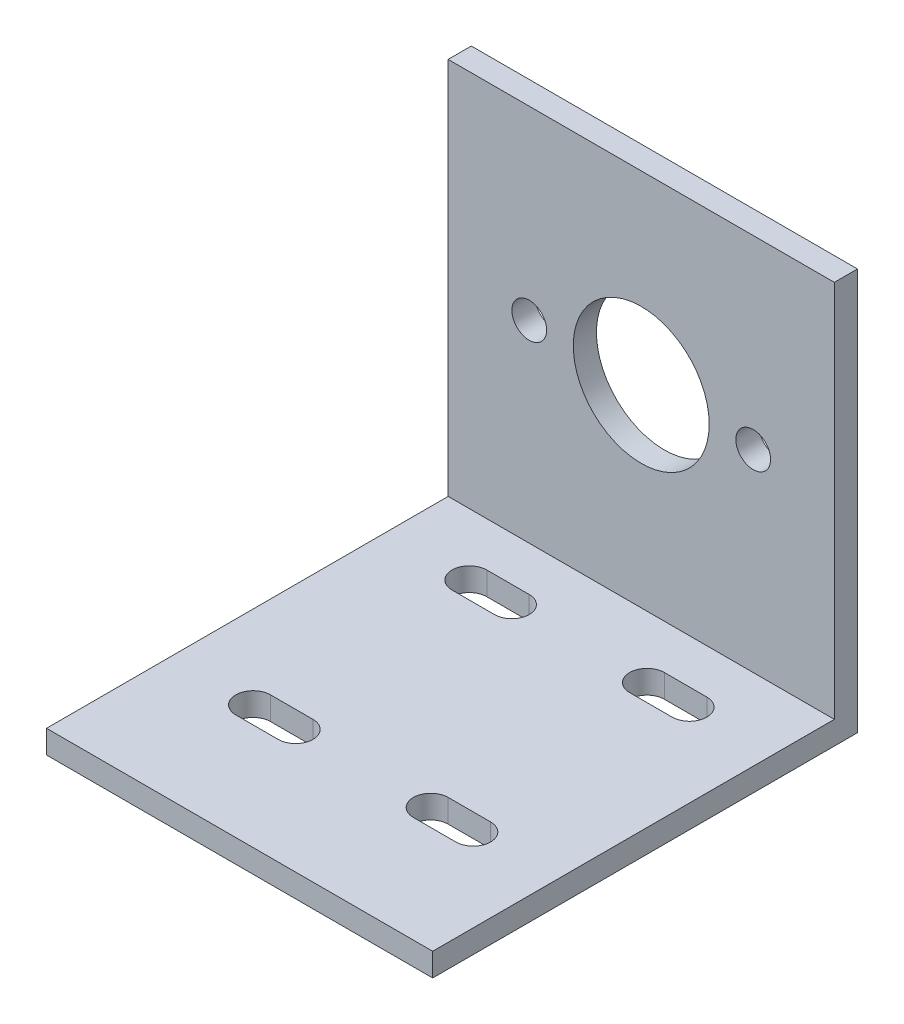
ISO-10303-21;
HEADER;
FILE_DESCRIPTION(('STEP AP214'),'2;1');
FILE_NAME('part.step','',(''),(''),'','','');
FILE_SCHEMA(('AUTOMOTIVE_DESIGN { 1 0 10303 214 1 1 1 1 }'));
ENDSEC;
DATA;
#1=APPLICATION_CONTEXT('core data for automotive mechanical design processes');
#2=APPLICATION_PROTOCOL_DEFINITION('international standard','automotive_design',2000,#1);
#3=PRODUCT_CONTEXT('',#1,'mechanical');
#4=PRODUCT('Part','Part','',(#3));
#5=PRODUCT_RELATED_PRODUCT_CATEGORY('part','',(#4));
#6=PRODUCT_DEFINITION_FORMATION('','',#4);
#7=PRODUCT_DEFINITION_CONTEXT('part definition',#1,'design');
#8=PRODUCT_DEFINITION('design','',#6,#7);
#9=PRODUCT_DEFINITION_SHAPE('','',#8);
#10=(LENGTH_UNIT() NAMED_UNIT(*) SI_UNIT(.MILLI.,.METRE.));
#11=(NAMED_UNIT(*) PLANE_ANGLE_UNIT() SI_UNIT($,.RADIAN.));
#12=(NAMED_UNIT(*) SI_UNIT($,.STERADIAN.) SOLID_ANGLE_UNIT());
#13=UNCERTAINTY_MEASURE_WITH_UNIT(LENGTH_MEASURE(1.E-05),#10,'distance_accuracy_value','');
#14=(GEOMETRIC_REPRESENTATION_CONTEXT(3) GLOBAL_UNCERTAINTY_ASSIGNED_CONTEXT((#13)) GLOBAL_UNIT_ASSIGNED_CONTEXT((#10,
#11,#12)) REPRESENTATION_CONTEXT('',''));
#15=CARTESIAN_POINT('',(0.,0.,0.));
#16=DIRECTION('',(0.,0.,1.));
#17=DIRECTION('',(1.,0.,0.));
#18=AXIS2_PLACEMENT_3D('',#15,#16,#17);
#19=CARTESIAN_POINT('',(0.,0.,3.));
#20=DIRECTION('',(0.,0.,-1.));
#21=DIRECTION('',(-1.,0.,0.));
#22=AXIS2_PLACEMENT_3D('',#19,#20,#21);
#23=PLANE('',#22);
#24=CARTESIAN_POINT('',(14.5,2.00000000000001,3.));
#25=DIRECTION('',(0.,0.,1.));
#26=DIRECTION('',(1.,0.,0.));
#27=AXIS2_PLACEMENT_3D('',#24,#25,#26);
#28=CIRCLE('',#27,2.25);
#29=CARTESIAN_POINT('',(16.75,2.00000000000001,3.));
#30=VERTEX_POINT('',#29);
#31=EDGE_CURVE('E398',#30,#30,#28,.T.);
#32=ORIENTED_EDGE('',*,*,#31,.F.);
#33=EDGE_LOOP('',(#32));
#34=FACE_BOUND('',#33,.T.);
#35=CARTESIAN_POINT('',(-14.5,2.,3.));
#36=DIRECTION('',(0.,0.,1.));
#37=DIRECTION('',(1.,0.,0.));
#38=AXIS2_PLACEMENT_3D('',#35,#36,#37);
#39=CIRCLE('',#38,2.25);
#40=CARTESIAN_POINT('',(-12.25,2.,3.));
#41=VERTEX_POINT('',#40);
#42=EDGE_CURVE('E406',#41,#41,#39,.T.);
#43=ORIENTED_EDGE('',*,*,#42,.F.);
#44=EDGE_LOOP('',(#43));
#45=FACE_BOUND('',#44,.T.);
#46=CARTESIAN_POINT('',(0.,2.,3.));
#47=DIRECTION('',(0.,0.,1.));
#48=DIRECTION('',(1.,0.,0.));
#49=AXIS2_PLACEMENT_3D('',#46,#47,#48);
#50=CIRCLE('',#49,8.79999999999999);
#51=CARTESIAN_POINT('',(8.79999999999999,2.,3.));
#52=VERTEX_POINT('',#51);
#53=EDGE_CURVE('E414',#52,#52,#50,.T.);
#54=ORIENTED_EDGE('',*,*,#53,.F.);
#55=EDGE_LOOP('',(#54));
#56=FACE_BOUND('',#55,.T.);
#57=DIRECTION('',(-1.,0.,0.));
#58=VECTOR('',#57,1.);
#59=CARTESIAN_POINT('',(-25.,-23.0001986940169,3.));
#60=LINE('',#59,#58);
#61=CARTESIAN_POINT('',(25.,-23.0001986940169,3.));
#62=VERTEX_POINT('',#61);
#63=CARTESIAN_POINT('',(-25.,-23.0001986940169,3.));
#64=VERTEX_POINT('',#63);
#65=EDGE_CURVE('E362',#62,#64,#60,.T.);
#66=ORIENTED_EDGE('',*,*,#65,.F.);
#67=DIRECTION('',(0.,1.,0.));
#68=VECTOR('',#67,1.);
#69=CARTESIAN_POINT('',(25.,-26.,3.));
#70=LINE('',#69,#68);
#71=CARTESIAN_POINT('',(25.,26.,3.));
#72=VERTEX_POINT('',#71);
#73=EDGE_CURVE('E422',#62,#72,#70,.T.);
#74=ORIENTED_EDGE('',*,*,#73,.T.);
#75=DIRECTION('',(-1.,0.,0.));
#76=VECTOR('',#75,1.);
#77=CARTESIAN_POINT('',(-25.,26.,3.));
#78=LINE('',#77,#76);
#79=CARTESIAN_POINT('',(-25.,26.,3.));
#80=VERTEX_POINT('',#79);
#81=EDGE_CURVE('E425',#72,#80,#78,.T.);
#82=ORIENTED_EDGE('',*,*,#81,.T.);
#83=DIRECTION('',(0.,-1.,0.));
#84=VECTOR('',#83,1.);
#85=CARTESIAN_POINT('',(-25.,-26.,3.));
#86=LINE('',#85,#84);
#87=EDGE_CURVE('E429',#80,#64,#86,.T.);
#88=ORIENTED_EDGE('',*,*,#87,.T.);
#89=EDGE_LOOP('',(#66,#74,#82,#88));
#90=FACE_BOUND('',#89,.T.);
#91=ADVANCED_FACE('F38',(#34,#45,#56,#90),#23,.F.);
#92=CARTESIAN_POINT('',(0.,0.,0.));
#93=DIRECTION('',(0.,0.,-1.));
#94=DIRECTION('',(-1.,0.,0.));
#95=AXIS2_PLACEMENT_3D('',#92,#93,#94);
#96=PLANE('',#95);
#97=CARTESIAN_POINT('',(-14.5,2.,0.));
#98=DIRECTION('',(0.,0.,1.));
#99=DIRECTION('',(1.,0.,0.));
#100=AXIS2_PLACEMENT_3D('',#97,#98,#99);
#101=CIRCLE('',#100,2.25);
#102=CARTESIAN_POINT('',(-12.25,2.,0.));
#103=VERTEX_POINT('',#102);
#104=EDGE_CURVE('E402',#103,#103,#101,.T.);
#105=ORIENTED_EDGE('',*,*,#104,.T.);
#106=EDGE_LOOP('',(#105));
#107=FACE_BOUND('',#106,.T.);
#108=DIRECTION('',(0.,1.,0.));
#109=VECTOR('',#108,1.);
#110=CARTESIAN_POINT('',(25.,-26.,0.));
#111=LINE('',#110,#109);
#112=CARTESIAN_POINT('',(25.,-26.,0.));
#113=VERTEX_POINT('',#112);
#114=CARTESIAN_POINT('',(25.,26.,0.));
#115=VERTEX_POINT('',#114);
#116=EDGE_CURVE('E418',#113,#115,#111,.T.);
#117=ORIENTED_EDGE('',*,*,#116,.F.);
#118=DIRECTION('',(1.,0.,0.));
#119=VECTOR('',#118,1.);
#120=CARTESIAN_POINT('',(-25.,-26.,0.));
#121=LINE('',#120,#119);
#122=CARTESIAN_POINT('',(-25.,-26.,0.));
#123=VERTEX_POINT('',#122);
#124=EDGE_CURVE('E426',#123,#113,#121,.T.);
#125=ORIENTED_EDGE('',*,*,#124,.F.);
#126=DIRECTION('',(0.,-1.,0.));
#127=VECTOR('',#126,1.);
#128=CARTESIAN_POINT('',(-25.,-26.,0.));
#129=LINE('',#128,#127);
#130=CARTESIAN_POINT('',(-25.,26.,0.));
#131=VERTEX_POINT('',#130);
#132=EDGE_CURVE('E439',#131,#123,#129,.T.);
#133=ORIENTED_EDGE('',*,*,#132,.F.);
#134=DIRECTION('',(-1.,0.,0.));
#135=VECTOR('',#134,1.);
#136=CARTESIAN_POINT('',(-25.,26.,0.));
#137=LINE('',#136,#135);
#138=EDGE_CURVE('E436',#115,#131,#137,.T.);
#139=ORIENTED_EDGE('',*,*,#138,.F.);
#140=EDGE_LOOP('',(#117,#125,#133,#139));
#141=FACE_BOUND('',#140,.T.);
#142=CARTESIAN_POINT('',(0.,2.,0.));
#143=DIRECTION('',(0.,0.,1.));
#144=DIRECTION('',(1.,0.,0.));
#145=AXIS2_PLACEMENT_3D('',#142,#143,#144);
#146=CIRCLE('',#145,8.79999999999999);
#147=CARTESIAN_POINT('',(8.79999999999999,2.,0.));
#148=VERTEX_POINT('',#147);
#149=EDGE_CURVE('E410',#148,#148,#146,.T.);
#150=ORIENTED_EDGE('',*,*,#149,.T.);
#151=EDGE_LOOP('',(#150));
#152=FACE_BOUND('',#151,.T.);
#153=CARTESIAN_POINT('',(14.5,2.00000000000001,0.));
#154=DIRECTION('',(0.,0.,1.));
#155=DIRECTION('',(1.,0.,0.));
#156=AXIS2_PLACEMENT_3D('',#153,#154,#155);
#157=CIRCLE('',#156,2.25);
#158=CARTESIAN_POINT('',(16.75,2.00000000000001,0.));
#159=VERTEX_POINT('',#158);
#160=EDGE_CURVE('E397',#159,#159,#157,.T.);
#161=ORIENTED_EDGE('',*,*,#160,.T.);
#162=EDGE_LOOP('',(#161));
#163=FACE_BOUND('',#162,.T.);
#164=ADVANCED_FACE('F462',(#107,#141,#152,#163),#96,.T.);
#165=CARTESIAN_POINT('',(25.,-26.,3.));
#166=DIRECTION('',(-1.,0.,0.));
#167=DIRECTION('',(0.,0.,1.));
#168=AXIS2_PLACEMENT_3D('',#165,#166,#167);
#169=PLANE('',#168);
#170=ORIENTED_EDGE('',*,*,#116,.T.);
#171=DIRECTION('',(0.,0.,-1.));
#172=VECTOR('',#171,1.);
#173=CARTESIAN_POINT('',(25.,26.,3.));
#174=LINE('',#173,#172);
#175=EDGE_CURVE('E11',#72,#115,#174,.T.);
#176=ORIENTED_EDGE('',*,*,#175,.F.);
#177=ORIENTED_EDGE('',*,*,#73,.F.);
#178=DIRECTION('',(0.,0.,-1.));
#179=VECTOR('',#178,1.);
#180=CARTESIAN_POINT('',(25.,-23.0001986940169,55.));
#181=LINE('',#180,#179);
#182=CARTESIAN_POINT('',(25.,-23.0001986940169,55.));
#183=VERTEX_POINT('',#182);
#184=EDGE_CURVE('E393',#183,#62,#181,.T.);
#185=ORIENTED_EDGE('',*,*,#184,.F.);
#186=DIRECTION('',(0.,1.,0.));
#187=VECTOR('',#186,1.);
#188=CARTESIAN_POINT('',(25.,-26.,55.));
#189=LINE('',#188,#187);
#190=CARTESIAN_POINT('',(25.,-26.,55.));
#191=VERTEX_POINT('',#190);
#192=EDGE_CURVE('E380',#191,#183,#189,.T.);
#193=ORIENTED_EDGE('',*,*,#192,.F.);
#194=DIRECTION('',(0.,0.,-1.));
#195=VECTOR('',#194,1.);
#196=CARTESIAN_POINT('',(25.,-26.,3.));
#197=LINE('',#196,#195);
#198=EDGE_CURVE('E432',#191,#113,#197,.T.);
#199=ORIENTED_EDGE('',*,*,#198,.T.);
#200=EDGE_LOOP('',(#170,#176,#177,#185,#193,#199));
#201=FACE_BOUND('',#200,.T.);
#202=ADVANCED_FACE('F40',(#201),#169,.F.);
#203=CARTESIAN_POINT('',(-25.,26.,3.));
#204=DIRECTION('',(0.,-1.,0.));
#205=DIRECTION('',(0.,0.,-1.));
#206=AXIS2_PLACEMENT_3D('',#203,#204,#205);
#207=PLANE('',#206);
#208=ORIENTED_EDGE('',*,*,#138,.T.);
#209=DIRECTION('',(0.,0.,-1.));
#210=VECTOR('',#209,1.);
#211=CARTESIAN_POINT('',(-25.,26.,3.));
#212=LINE('',#211,#210);
#213=EDGE_CURVE('E47',#80,#131,#212,.T.);
#214=ORIENTED_EDGE('',*,*,#213,.F.);
#215=ORIENTED_EDGE('',*,*,#81,.F.);
#216=ORIENTED_EDGE('',*,*,#175,.T.);
#217=EDGE_LOOP('',(#208,#214,#215,#216));
#218=FACE_BOUND('',#217,.T.);
#219=ADVANCED_FACE('F479',(#218),#207,.F.);
#220=CARTESIAN_POINT('',(-25.,-26.,3.));
#221=DIRECTION('',(1.,0.,0.));
#222=DIRECTION('',(0.,0.,-1.));
#223=AXIS2_PLACEMENT_3D('',#220,#221,#222);
#224=PLANE('',#223);
#225=ORIENTED_EDGE('',*,*,#132,.T.);
#226=DIRECTION('',(0.,0.,-1.));
#227=VECTOR('',#226,1.);
#228=CARTESIAN_POINT('',(-25.,-26.,3.));
#229=LINE('',#228,#227);
#230=CARTESIAN_POINT('',(-25.,-26.,55.));
#231=VERTEX_POINT('',#230);
#232=EDGE_CURVE('E447',#231,#123,#229,.T.);
#233=ORIENTED_EDGE('',*,*,#232,.F.);
#234=DIRECTION('',(0.,-1.,0.));
#235=VECTOR('',#234,1.);
#236=CARTESIAN_POINT('',(-25.,-26.,55.));
#237=LINE('',#236,#235);
#238=CARTESIAN_POINT('',(-25.,-23.0001986940169,55.));
#239=VERTEX_POINT('',#238);
#240=EDGE_CURVE('E372',#239,#231,#237,.T.);
#241=ORIENTED_EDGE('',*,*,#240,.F.);
#242=DIRECTION('',(0.,0.,-1.));
#243=VECTOR('',#242,1.);
#244=CARTESIAN_POINT('',(-25.,-23.0001986940169,55.));
#245=LINE('',#244,#243);
#246=EDGE_CURVE('E386',#239,#64,#245,.T.);
#247=ORIENTED_EDGE('',*,*,#246,.T.);
#248=ORIENTED_EDGE('',*,*,#87,.F.);
#249=ORIENTED_EDGE('',*,*,#213,.T.);
#250=EDGE_LOOP('',(#225,#233,#241,#247,#248,#249));
#251=FACE_BOUND('',#250,.T.);
#252=ADVANCED_FACE('F456',(#251),#224,.F.);
#253=CARTESIAN_POINT('',(-25.,-26.,3.));
#254=DIRECTION('',(0.,1.,0.));
#255=DIRECTION('',(0.,0.,1.));
#256=AXIS2_PLACEMENT_3D('',#253,#254,#255);
#257=PLANE('',#256);
#258=DIRECTION('',(-1.,0.,0.));
#259=VECTOR('',#258,1.);
#260=CARTESIAN_POINT('',(8.75,-26.,36.75));
#261=LINE('',#260,#259);
#262=CARTESIAN_POINT('',(14.25,-26.,36.75));
#263=VERTEX_POINT('',#262);
#264=CARTESIAN_POINT('',(8.75,-26.,36.75));
#265=VERTEX_POINT('',#264);
#266=EDGE_CURVE('E255',#263,#265,#261,.T.);
#267=ORIENTED_EDGE('',*,*,#266,.T.);
#268=CARTESIAN_POINT('',(8.75,-26.,39.));
#269=DIRECTION('',(0.,1.,0.));
#270=DIRECTION('',(0.,0.,1.));
#271=AXIS2_PLACEMENT_3D('',#268,#269,#270);
#272=CIRCLE('',#271,2.25);
#273=CARTESIAN_POINT('',(8.75,-26.,41.25));
#274=VERTEX_POINT('',#273);
#275=EDGE_CURVE('E244',#265,#274,#272,.T.);
#276=ORIENTED_EDGE('',*,*,#275,.T.);
#277=DIRECTION('',(1.,0.,0.));
#278=VECTOR('',#277,1.);
#279=CARTESIAN_POINT('',(8.75,-26.,41.25));
#280=LINE('',#279,#278);
#281=CARTESIAN_POINT('',(14.25,-26.,41.25));
#282=VERTEX_POINT('',#281);
#283=EDGE_CURVE('E248',#274,#282,#280,.T.);
#284=ORIENTED_EDGE('',*,*,#283,.T.);
#285=CARTESIAN_POINT('',(14.25,-26.,39.));
#286=DIRECTION('',(0.,1.,0.));
#287=DIRECTION('',(0.,0.,1.));
#288=AXIS2_PLACEMENT_3D('',#285,#286,#287);
#289=CIRCLE('',#288,2.25);
#290=EDGE_CURVE('E54',#282,#263,#289,.T.);
#291=ORIENTED_EDGE('',*,*,#290,.T.);
#292=EDGE_LOOP('',(#267,#276,#284,#291));
#293=FACE_BOUND('',#292,.T.);
#294=DIRECTION('',(-1.,0.,0.));
#295=VECTOR('',#294,1.);
#296=CARTESIAN_POINT('',(-14.25,-26.,8.75000000000001));
#297=LINE('',#296,#295);
#298=CARTESIAN_POINT('',(-8.74999999999999,-26.,8.75000000000001));
#299=VERTEX_POINT('',#298);
#300=CARTESIAN_POINT('',(-14.25,-26.,8.75000000000001));
#301=VERTEX_POINT('',#300);
#302=EDGE_CURVE('E299',#299,#301,#297,.T.);
#303=ORIENTED_EDGE('',*,*,#302,.T.);
#304=CARTESIAN_POINT('',(-14.25,-26.,11.));
#305=DIRECTION('',(0.,1.,0.));
#306=DIRECTION('',(0.,0.,1.));
#307=AXIS2_PLACEMENT_3D('',#304,#305,#306);
#308=CIRCLE('',#307,2.25);
#309=CARTESIAN_POINT('',(-14.25,-26.,13.25));
#310=VERTEX_POINT('',#309);
#311=EDGE_CURVE('E288',#301,#310,#308,.T.);
#312=ORIENTED_EDGE('',*,*,#311,.T.);
#313=DIRECTION('',(1.,0.,0.));
#314=VECTOR('',#313,1.);
#315=CARTESIAN_POINT('',(-14.25,-26.,13.25));
#316=LINE('',#315,#314);
#317=CARTESIAN_POINT('',(-8.74999999999998,-26.,13.25));
#318=VERTEX_POINT('',#317);
#319=EDGE_CURVE('E292',#310,#318,#316,.T.);
#320=ORIENTED_EDGE('',*,*,#319,.T.);
#321=CARTESIAN_POINT('',(-8.74999999999999,-26.,11.));
#322=DIRECTION('',(0.,1.,0.));
#323=DIRECTION('',(0.,0.,1.));
#324=AXIS2_PLACEMENT_3D('',#321,#322,#323);
#325=CIRCLE('',#324,2.25);
#326=EDGE_CURVE('E62',#318,#299,#325,.T.);
#327=ORIENTED_EDGE('',*,*,#326,.T.);
#328=EDGE_LOOP('',(#303,#312,#320,#327));
#329=FACE_BOUND('',#328,.T.);
#330=DIRECTION('',(-1.,0.,0.));
#331=VECTOR('',#330,1.);
#332=CARTESIAN_POINT('',(8.75,-26.,8.75000000000001));
#333=LINE('',#332,#331);
#334=CARTESIAN_POINT('',(14.25,-26.,8.75000000000001));
#335=VERTEX_POINT('',#334);
#336=CARTESIAN_POINT('',(8.75,-26.,8.75000000000001));
#337=VERTEX_POINT('',#336);
#338=EDGE_CURVE('E201',#335,#337,#333,.T.);
#339=ORIENTED_EDGE('',*,*,#338,.T.);
#340=CARTESIAN_POINT('',(8.75,-26.,11.));
#341=DIRECTION('',(0.,1.,0.));
#342=DIRECTION('',(0.,0.,1.));
#343=AXIS2_PLACEMENT_3D('',#340,#341,#342);
#344=CIRCLE('',#343,2.25);
#345=CARTESIAN_POINT('',(8.75,-26.,13.25));
#346=VERTEX_POINT('',#345);
#347=EDGE_CURVE('E192',#337,#346,#344,.T.);
#348=ORIENTED_EDGE('',*,*,#347,.T.);
#349=DIRECTION('',(1.,0.,0.));
#350=VECTOR('',#349,1.);
#351=CARTESIAN_POINT('',(8.75,-26.,13.25));
#352=LINE('',#351,#350);
#353=CARTESIAN_POINT('',(14.25,-26.,13.25));
#354=VERTEX_POINT('',#353);
#355=EDGE_CURVE('E205',#346,#354,#352,.T.);
#356=ORIENTED_EDGE('',*,*,#355,.T.);
#357=CARTESIAN_POINT('',(14.25,-26.,11.));
#358=DIRECTION('',(0.,1.,0.));
#359=DIRECTION('',(0.,0.,1.));
#360=AXIS2_PLACEMENT_3D('',#357,#358,#359);
#361=CIRCLE('',#360,2.25);
#362=EDGE_CURVE('E210',#354,#335,#361,.T.);
#363=ORIENTED_EDGE('',*,*,#362,.T.);
#364=EDGE_LOOP('',(#339,#348,#356,#363));
#365=FACE_BOUND('',#364,.T.);
#366=DIRECTION('',(-1.,0.,0.));
#367=VECTOR('',#366,1.);
#368=CARTESIAN_POINT('',(-14.25,-26.,36.75));
#369=LINE('',#368,#367);
#370=CARTESIAN_POINT('',(-8.74999999999999,-26.,36.75));
#371=VERTEX_POINT('',#370);
#372=CARTESIAN_POINT('',(-14.25,-26.,36.75));
#373=VERTEX_POINT('',#372);
#374=EDGE_CURVE('E341',#371,#373,#369,.T.);
#375=ORIENTED_EDGE('',*,*,#374,.T.);
#376=CARTESIAN_POINT('',(-14.25,-26.,39.));
#377=DIRECTION('',(0.,1.,0.));
#378=DIRECTION('',(0.,0.,1.));
#379=AXIS2_PLACEMENT_3D('',#376,#377,#378);
#380=CIRCLE('',#379,2.25);
#381=CARTESIAN_POINT('',(-14.25,-26.,41.25));
#382=VERTEX_POINT('',#381);
#383=EDGE_CURVE('E328',#373,#382,#380,.T.);
#384=ORIENTED_EDGE('',*,*,#383,.T.);
#385=DIRECTION('',(1.,0.,0.));
#386=VECTOR('',#385,1.);
#387=CARTESIAN_POINT('',(-14.25,-26.,41.25));
#388=LINE('',#387,#386);
#389=CARTESIAN_POINT('',(-8.74999999999999,-26.,41.25));
#390=VERTEX_POINT('',#389);
#391=EDGE_CURVE('E332',#382,#390,#388,.T.);
#392=ORIENTED_EDGE('',*,*,#391,.T.);
#393=CARTESIAN_POINT('',(-8.74999999999999,-26.,39.));
#394=DIRECTION('',(0.,1.,0.));
#395=DIRECTION('',(0.,0.,1.));
#396=AXIS2_PLACEMENT_3D('',#393,#394,#395);
#397=CIRCLE('',#396,2.25);
#398=EDGE_CURVE('E337',#390,#371,#397,.T.);
#399=ORIENTED_EDGE('',*,*,#398,.T.);
#400=EDGE_LOOP('',(#375,#384,#392,#399));
#401=FACE_BOUND('',#400,.T.);
#402=ORIENTED_EDGE('',*,*,#124,.T.);
#403=ORIENTED_EDGE('',*,*,#198,.F.);
#404=DIRECTION('',(1.,0.,0.));
#405=VECTOR('',#404,1.);
#406=CARTESIAN_POINT('',(-25.,-26.,55.));
#407=LINE('',#406,#405);
#408=EDGE_CURVE('E376',#231,#191,#407,.T.);
#409=ORIENTED_EDGE('',*,*,#408,.F.);
#410=ORIENTED_EDGE('',*,*,#232,.T.);
#411=EDGE_LOOP('',(#402,#403,#409,#410));
#412=FACE_BOUND('',#411,.T.);
#413=ADVANCED_FACE('F212',(#293,#329,#365,#401,#412),#257,.F.);
#414=CARTESIAN_POINT('',(0.,2.,3.));
#415=DIRECTION('',(0.,0.,-1.));
#416=DIRECTION('',(-1.,0.,0.));
#417=AXIS2_PLACEMENT_3D('',#414,#415,#416);
#418=CYLINDRICAL_SURFACE('',#417,8.79999999999999);
#419=ORIENTED_EDGE('',*,*,#53,.T.);
#420=EDGE_LOOP('',(#419));
#421=FACE_BOUND('',#420,.T.);
#422=ORIENTED_EDGE('',*,*,#149,.F.);
#423=EDGE_LOOP('',(#422));
#424=FACE_BOUND('',#423,.T.);
#425=ADVANCED_FACE('F497',(#421,#424),#418,.F.);
#426=CARTESIAN_POINT('',(-14.5,2.,3.));
#427=DIRECTION('',(0.,0.,-1.));
#428=DIRECTION('',(-1.,0.,0.));
#429=AXIS2_PLACEMENT_3D('',#426,#427,#428);
#430=CYLINDRICAL_SURFACE('',#429,2.25);
#431=ORIENTED_EDGE('',*,*,#42,.T.);
#432=EDGE_LOOP('',(#431));
#433=FACE_BOUND('',#432,.T.);
#434=ORIENTED_EDGE('',*,*,#104,.F.);
#435=EDGE_LOOP('',(#434));
#436=FACE_BOUND('',#435,.T.);
#437=ADVANCED_FACE('F505',(#433,#436),#430,.F.);
#438=CARTESIAN_POINT('',(14.5,2.00000000000001,3.));
#439=DIRECTION('',(0.,0.,-1.));
#440=DIRECTION('',(-1.,0.,0.));
#441=AXIS2_PLACEMENT_3D('',#438,#439,#440);
#442=CYLINDRICAL_SURFACE('',#441,2.25);
#443=ORIENTED_EDGE('',*,*,#31,.T.);
#444=EDGE_LOOP('',(#443));
#445=FACE_BOUND('',#444,.T.);
#446=ORIENTED_EDGE('',*,*,#160,.F.);
#447=EDGE_LOOP('',(#446));
#448=FACE_BOUND('',#447,.T.);
#449=ADVANCED_FACE('F526',(#445,#448),#442,.F.);
#450=CARTESIAN_POINT('',(-25.,-23.0001986940169,55.));
#451=DIRECTION('',(0.,-1.,0.));
#452=DIRECTION('',(0.,0.,-1.));
#453=AXIS2_PLACEMENT_3D('',#450,#451,#452);
#454=PLANE('',#453);
#455=DIRECTION('',(1.,0.,0.));
#456=VECTOR('',#455,1.);
#457=CARTESIAN_POINT('',(8.75,-23.0001986940169,41.25));
#458=LINE('',#457,#456);
#459=CARTESIAN_POINT('',(8.75000000000001,-23.0001986940169,41.25));
#460=VERTEX_POINT('',#459);
#461=CARTESIAN_POINT('',(14.25,-23.0001986940169,41.25));
#462=VERTEX_POINT('',#461);
#463=EDGE_CURVE('E263',#460,#462,#458,.T.);
#464=ORIENTED_EDGE('',*,*,#463,.F.);
#465=CARTESIAN_POINT('',(8.75,-23.0001986940169,39.));
#466=DIRECTION('',(0.,1.,0.));
#467=DIRECTION('',(0.,0.,1.));
#468=AXIS2_PLACEMENT_3D('',#465,#466,#467);
#469=CIRCLE('',#468,2.25);
#470=CARTESIAN_POINT('',(8.75,-23.0001986940169,36.75));
#471=VERTEX_POINT('',#470);
#472=EDGE_CURVE('E260',#471,#460,#469,.T.);
#473=ORIENTED_EDGE('',*,*,#472,.F.);
#474=DIRECTION('',(-1.,0.,0.));
#475=VECTOR('',#474,1.);
#476=CARTESIAN_POINT('',(8.75,-23.0001986940169,36.75));
#477=LINE('',#476,#475);
#478=CARTESIAN_POINT('',(14.25,-23.0001986940169,36.75));
#479=VERTEX_POINT('',#478);
#480=EDGE_CURVE('E249',#479,#471,#477,.T.);
#481=ORIENTED_EDGE('',*,*,#480,.F.);
#482=CARTESIAN_POINT('',(14.25,-23.0001986940169,39.));
#483=DIRECTION('',(0.,1.,0.));
#484=DIRECTION('',(0.,0.,1.));
#485=AXIS2_PLACEMENT_3D('',#482,#483,#484);
#486=CIRCLE('',#485,2.25);
#487=EDGE_CURVE('E268',#462,#479,#486,.T.);
#488=ORIENTED_EDGE('',*,*,#487,.F.);
#489=EDGE_LOOP('',(#464,#473,#481,#488));
#490=FACE_BOUND('',#489,.T.);
#491=DIRECTION('',(1.,0.,0.));
#492=VECTOR('',#491,1.);
#493=CARTESIAN_POINT('',(-14.25,-23.0001986940169,13.25));
#494=LINE('',#493,#492);
#495=CARTESIAN_POINT('',(-14.25,-23.0001986940169,13.25));
#496=VERTEX_POINT('',#495);
#497=CARTESIAN_POINT('',(-8.74999999999998,-23.0001986940169,13.25));
#498=VERTEX_POINT('',#497);
#499=EDGE_CURVE('E306',#496,#498,#494,.T.);
#500=ORIENTED_EDGE('',*,*,#499,.F.);
#501=CARTESIAN_POINT('',(-14.25,-23.0001986940169,11.));
#502=DIRECTION('',(0.,1.,0.));
#503=DIRECTION('',(0.,0.,1.));
#504=AXIS2_PLACEMENT_3D('',#501,#502,#503);
#505=CIRCLE('',#504,2.25);
#506=CARTESIAN_POINT('',(-14.25,-23.0001986940169,8.75000000000001));
#507=VERTEX_POINT('',#506);
#508=EDGE_CURVE('E238',#507,#496,#505,.T.);
#509=ORIENTED_EDGE('',*,*,#508,.F.);
#510=DIRECTION('',(-1.,0.,0.));
#511=VECTOR('',#510,1.);
#512=CARTESIAN_POINT('',(-14.25,-23.0001986940169,8.75000000000001));
#513=LINE('',#512,#511);
#514=CARTESIAN_POINT('',(-8.74999999999999,-23.0001986940169,8.75000000000001));
#515=VERTEX_POINT('',#514);
#516=EDGE_CURVE('E293',#515,#507,#513,.T.);
#517=ORIENTED_EDGE('',*,*,#516,.F.);
#518=CARTESIAN_POINT('',(-8.74999999999999,-23.0001986940169,11.));
#519=DIRECTION('',(0.,1.,0.));
#520=DIRECTION('',(0.,0.,1.));
#521=AXIS2_PLACEMENT_3D('',#518,#519,#520);
#522=CIRCLE('',#521,2.25);
#523=EDGE_CURVE('E310',#498,#515,#522,.T.);
#524=ORIENTED_EDGE('',*,*,#523,.F.);
#525=EDGE_LOOP('',(#500,#509,#517,#524));
#526=FACE_BOUND('',#525,.T.);
#527=DIRECTION('',(1.,0.,0.));
#528=VECTOR('',#527,1.);
#529=CARTESIAN_POINT('',(8.75,-23.0001986940169,13.25));
#530=LINE('',#529,#528);
#531=CARTESIAN_POINT('',(8.75000000000001,-23.0001986940169,13.25));
#532=VERTEX_POINT('',#531);
#533=CARTESIAN_POINT('',(14.25,-23.0001986940169,13.25));
#534=VERTEX_POINT('',#533);
#535=EDGE_CURVE('E229',#532,#534,#530,.T.);
#536=ORIENTED_EDGE('',*,*,#535,.F.);
#537=CARTESIAN_POINT('',(8.75,-23.0001986940169,11.));
#538=DIRECTION('',(0.,1.,0.));
#539=DIRECTION('',(0.,0.,1.));
#540=AXIS2_PLACEMENT_3D('',#537,#538,#539);
#541=CIRCLE('',#540,2.25);
#542=CARTESIAN_POINT('',(8.75,-23.0001986940169,8.75000000000001));
#543=VERTEX_POINT('',#542);
#544=EDGE_CURVE('E195',#543,#532,#541,.T.);
#545=ORIENTED_EDGE('',*,*,#544,.F.);
#546=DIRECTION('',(-1.,0.,0.));
#547=VECTOR('',#546,1.);
#548=CARTESIAN_POINT('',(8.75,-23.0001986940169,8.75000000000001));
#549=LINE('',#548,#547);
#550=CARTESIAN_POINT('',(14.25,-23.0001986940169,8.75000000000001));
#551=VERTEX_POINT('',#550);
#552=EDGE_CURVE('E216',#551,#543,#549,.T.);
#553=ORIENTED_EDGE('',*,*,#552,.F.);
#554=CARTESIAN_POINT('',(14.25,-23.0001986940169,11.));
#555=DIRECTION('',(0.,1.,0.));
#556=DIRECTION('',(0.,0.,1.));
#557=AXIS2_PLACEMENT_3D('',#554,#555,#556);
#558=CIRCLE('',#557,2.25);
#559=EDGE_CURVE('E220',#534,#551,#558,.T.);
#560=ORIENTED_EDGE('',*,*,#559,.F.);
#561=EDGE_LOOP('',(#536,#545,#553,#560));
#562=FACE_BOUND('',#561,.T.);
#563=DIRECTION('',(1.,0.,0.));
#564=VECTOR('',#563,1.);
#565=CARTESIAN_POINT('',(-14.25,-23.0001986940169,41.25));
#566=LINE('',#565,#564);
#567=CARTESIAN_POINT('',(-14.25,-23.0001986940169,41.25));
#568=VERTEX_POINT('',#567);
#569=CARTESIAN_POINT('',(-8.74999999999999,-23.0001986940169,41.25));
#570=VERTEX_POINT('',#569);
#571=EDGE_CURVE('E348',#568,#570,#566,.T.);
#572=ORIENTED_EDGE('',*,*,#571,.F.);
#573=CARTESIAN_POINT('',(-14.25,-23.0001986940169,39.));
#574=DIRECTION('',(0.,1.,0.));
#575=DIRECTION('',(0.,0.,1.));
#576=AXIS2_PLACEMENT_3D('',#573,#574,#575);
#577=CIRCLE('',#576,2.25);
#578=CARTESIAN_POINT('',(-14.25,-23.0001986940169,36.75));
#579=VERTEX_POINT('',#578);
#580=EDGE_CURVE('E278',#579,#568,#577,.T.);
#581=ORIENTED_EDGE('',*,*,#580,.F.);
#582=DIRECTION('',(-1.,0.,0.));
#583=VECTOR('',#582,1.);
#584=CARTESIAN_POINT('',(-14.25,-23.0001986940169,36.75));
#585=LINE('',#584,#583);
#586=CARTESIAN_POINT('',(-8.74999999999999,-23.0001986940169,36.75));
#587=VERTEX_POINT('',#586);
#588=EDGE_CURVE('E333',#587,#579,#585,.T.);
#589=ORIENTED_EDGE('',*,*,#588,.F.);
#590=CARTESIAN_POINT('',(-8.74999999999999,-23.0001986940169,39.));
#591=DIRECTION('',(0.,1.,0.));
#592=DIRECTION('',(0.,0.,1.));
#593=AXIS2_PLACEMENT_3D('',#590,#591,#592);
#594=CIRCLE('',#593,2.25);
#595=EDGE_CURVE('E352',#570,#587,#594,.T.);
#596=ORIENTED_EDGE('',*,*,#595,.F.);
#597=EDGE_LOOP('',(#572,#581,#589,#596));
#598=FACE_BOUND('',#597,.T.);
#599=ORIENTED_EDGE('',*,*,#65,.T.);
#600=ORIENTED_EDGE('',*,*,#246,.F.);
#601=DIRECTION('',(-1.,0.,0.));
#602=VECTOR('',#601,1.);
#603=CARTESIAN_POINT('',(-25.,-23.0001986940169,55.));
#604=LINE('',#603,#602);
#605=EDGE_CURVE('E383',#183,#239,#604,.T.);
#606=ORIENTED_EDGE('',*,*,#605,.F.);
#607=ORIENTED_EDGE('',*,*,#184,.T.);
#608=EDGE_LOOP('',(#599,#600,#606,#607));
#609=FACE_BOUND('',#608,.T.);
#610=ADVANCED_FACE('F477',(#490,#526,#562,#598,#609),#454,.F.);
#611=CARTESIAN_POINT('',(0.,0.,55.));
#612=DIRECTION('',(0.,0.,-1.));
#613=DIRECTION('',(-1.,0.,0.));
#614=AXIS2_PLACEMENT_3D('',#611,#612,#613);
#615=PLANE('',#614);
#616=ORIENTED_EDGE('',*,*,#240,.T.);
#617=ORIENTED_EDGE('',*,*,#408,.T.);
#618=ORIENTED_EDGE('',*,*,#192,.T.);
#619=ORIENTED_EDGE('',*,*,#605,.T.);
#620=EDGE_LOOP('',(#616,#617,#618,#619));
#621=FACE_BOUND('',#620,.T.);
#622=ADVANCED_FACE('F473',(#621),#615,.F.);
#623=CARTESIAN_POINT('',(-14.25,-26.,39.));
#624=DIRECTION('',(0.,1.,0.));
#625=DIRECTION('',(0.,0.,1.));
#626=AXIS2_PLACEMENT_3D('',#623,#624,#625);
#627=CYLINDRICAL_SURFACE('',#626,2.25);
#628=ORIENTED_EDGE('',*,*,#580,.T.);
#629=DIRECTION('',(0.,1.,0.));
#630=VECTOR('',#629,1.);
#631=CARTESIAN_POINT('',(-14.25,-26.,41.25));
#632=LINE('',#631,#630);
#633=EDGE_CURVE('E345',#382,#568,#632,.T.);
#634=ORIENTED_EDGE('',*,*,#633,.F.);
#635=ORIENTED_EDGE('',*,*,#383,.F.);
#636=DIRECTION('',(0.,1.,0.));
#637=VECTOR('',#636,1.);
#638=CARTESIAN_POINT('',(-14.25,-26.,36.75));
#639=LINE('',#638,#637);
#640=EDGE_CURVE('E359',#373,#579,#639,.T.);
#641=ORIENTED_EDGE('',*,*,#640,.T.);
#642=EDGE_LOOP('',(#628,#634,#635,#641));
#643=FACE_BOUND('',#642,.T.);
#644=ADVANCED_FACE('F541',(#643),#627,.F.);
#645=CARTESIAN_POINT('',(-14.25,-26.,36.75));
#646=DIRECTION('',(0.,0.,-1.));
#647=DIRECTION('',(-1.,0.,0.));
#648=AXIS2_PLACEMENT_3D('',#645,#646,#647);
#649=PLANE('',#648);
#650=ORIENTED_EDGE('',*,*,#588,.T.);
#651=ORIENTED_EDGE('',*,*,#640,.F.);
#652=ORIENTED_EDGE('',*,*,#374,.F.);
#653=DIRECTION('',(0.,1.,0.));
#654=VECTOR('',#653,1.);
#655=CARTESIAN_POINT('',(-8.74999999999999,-26.,36.75));
#656=LINE('',#655,#654);
#657=EDGE_CURVE('E363',#371,#587,#656,.T.);
#658=ORIENTED_EDGE('',*,*,#657,.T.);
#659=EDGE_LOOP('',(#650,#651,#652,#658));
#660=FACE_BOUND('',#659,.T.);
#661=ADVANCED_FACE('F544',(#660),#649,.F.);
#662=CARTESIAN_POINT('',(-8.74999999999999,-26.,39.));
#663=DIRECTION('',(0.,1.,0.));
#664=DIRECTION('',(0.,0.,1.));
#665=AXIS2_PLACEMENT_3D('',#662,#663,#664);
#666=CYLINDRICAL_SURFACE('',#665,2.25);
#667=ORIENTED_EDGE('',*,*,#595,.T.);
#668=ORIENTED_EDGE('',*,*,#657,.F.);
#669=ORIENTED_EDGE('',*,*,#398,.F.);
#670=DIRECTION('',(0.,1.,0.));
#671=VECTOR('',#670,1.);
#672=CARTESIAN_POINT('',(-8.74999999999999,-26.,41.25));
#673=LINE('',#672,#671);
#674=EDGE_CURVE('E366',#390,#570,#673,.T.);
#675=ORIENTED_EDGE('',*,*,#674,.T.);
#676=EDGE_LOOP('',(#667,#668,#669,#675));
#677=FACE_BOUND('',#676,.T.);
#678=ADVANCED_FACE('F546',(#677),#666,.F.);
#679=CARTESIAN_POINT('',(-14.25,-26.,41.25));
#680=DIRECTION('',(0.,0.,1.));
#681=DIRECTION('',(1.,0.,0.));
#682=AXIS2_PLACEMENT_3D('',#679,#680,#681);
#683=PLANE('',#682);
#684=ORIENTED_EDGE('',*,*,#571,.T.);
#685=ORIENTED_EDGE('',*,*,#674,.F.);
#686=ORIENTED_EDGE('',*,*,#391,.F.);
#687=ORIENTED_EDGE('',*,*,#633,.T.);
#688=EDGE_LOOP('',(#684,#685,#686,#687));
#689=FACE_BOUND('',#688,.T.);
#690=ADVANCED_FACE('F537',(#689),#683,.F.);
#691=CARTESIAN_POINT('',(8.75,-26.,11.));
#692=DIRECTION('',(0.,1.,0.));
#693=DIRECTION('',(0.,0.,1.));
#694=AXIS2_PLACEMENT_3D('',#691,#692,#693);
#695=CYLINDRICAL_SURFACE('',#694,2.25);
#696=ORIENTED_EDGE('',*,*,#544,.T.);
#697=DIRECTION('',(0.,1.,0.));
#698=VECTOR('',#697,1.);
#699=CARTESIAN_POINT('',(8.75,-26.,13.25));
#700=LINE('',#699,#698);
#701=EDGE_CURVE('E188',#346,#532,#700,.T.);
#702=ORIENTED_EDGE('',*,*,#701,.F.);
#703=ORIENTED_EDGE('',*,*,#347,.F.);
#704=DIRECTION('',(0.,1.,0.));
#705=VECTOR('',#704,1.);
#706=CARTESIAN_POINT('',(8.75,-26.,8.75000000000001));
#707=LINE('',#706,#705);
#708=EDGE_CURVE('E235',#337,#543,#707,.T.);
#709=ORIENTED_EDGE('',*,*,#708,.T.);
#710=EDGE_LOOP('',(#696,#702,#703,#709));
#711=FACE_BOUND('',#710,.T.);
#712=ADVANCED_FACE('F190',(#711),#695,.F.);
#713=CARTESIAN_POINT('',(8.75,-26.,8.75000000000001));
#714=DIRECTION('',(0.,0.,-1.));
#715=DIRECTION('',(-1.,0.,0.));
#716=AXIS2_PLACEMENT_3D('',#713,#714,#715);
#717=PLANE('',#716);
#718=ORIENTED_EDGE('',*,*,#552,.T.);
#719=ORIENTED_EDGE('',*,*,#708,.F.);
#720=ORIENTED_EDGE('',*,*,#338,.F.);
#721=DIRECTION('',(0.,1.,0.));
#722=VECTOR('',#721,1.);
#723=CARTESIAN_POINT('',(14.25,-26.,8.75000000000001));
#724=LINE('',#723,#722);
#725=EDGE_CURVE('E239',#335,#551,#724,.T.);
#726=ORIENTED_EDGE('',*,*,#725,.T.);
#727=EDGE_LOOP('',(#718,#719,#720,#726));
#728=FACE_BOUND('',#727,.T.);
#729=ADVANCED_FACE('F619',(#728),#717,.F.);
#730=CARTESIAN_POINT('',(14.25,-26.,11.));
#731=DIRECTION('',(0.,1.,0.));
#732=DIRECTION('',(0.,0.,1.));
#733=AXIS2_PLACEMENT_3D('',#730,#731,#732);
#734=CYLINDRICAL_SURFACE('',#733,2.25);
#735=ORIENTED_EDGE('',*,*,#559,.T.);
#736=ORIENTED_EDGE('',*,*,#725,.F.);
#737=ORIENTED_EDGE('',*,*,#362,.F.);
#738=DIRECTION('',(0.,1.,0.));
#739=VECTOR('',#738,1.);
#740=CARTESIAN_POINT('',(14.25,-26.,13.25));
#741=LINE('',#740,#739);
#742=EDGE_CURVE('E200',#354,#534,#741,.T.);
#743=ORIENTED_EDGE('',*,*,#742,.T.);
#744=EDGE_LOOP('',(#735,#736,#737,#743));
#745=FACE_BOUND('',#744,.T.);
#746=ADVANCED_FACE('F628',(#745),#734,.F.);
#747=CARTESIAN_POINT('',(8.75,-26.,13.25));
#748=DIRECTION('',(0.,0.,1.));
#749=DIRECTION('',(1.,0.,0.));
#750=AXIS2_PLACEMENT_3D('',#747,#748,#749);
#751=PLANE('',#750);
#752=ORIENTED_EDGE('',*,*,#535,.T.);
#753=ORIENTED_EDGE('',*,*,#742,.F.);
#754=ORIENTED_EDGE('',*,*,#355,.F.);
#755=ORIENTED_EDGE('',*,*,#701,.T.);
#756=EDGE_LOOP('',(#752,#753,#754,#755));
#757=FACE_BOUND('',#756,.T.);
#758=ADVANCED_FACE('F206',(#757),#751,.F.);
#759=CARTESIAN_POINT('',(-14.25,-26.,11.));
#760=DIRECTION('',(0.,1.,0.));
#761=DIRECTION('',(0.,0.,1.));
#762=AXIS2_PLACEMENT_3D('',#759,#760,#761);
#763=CYLINDRICAL_SURFACE('',#762,2.25);
#764=ORIENTED_EDGE('',*,*,#508,.T.);
#765=DIRECTION('',(0.,1.,0.));
#766=VECTOR('',#765,1.);
#767=CARTESIAN_POINT('',(-14.25,-26.,13.25));
#768=LINE('',#767,#766);
#769=EDGE_CURVE('E303',#310,#496,#768,.T.);
#770=ORIENTED_EDGE('',*,*,#769,.F.);
#771=ORIENTED_EDGE('',*,*,#311,.F.);
#772=DIRECTION('',(0.,1.,0.));
#773=VECTOR('',#772,1.);
#774=CARTESIAN_POINT('',(-14.25,-26.,8.75000000000001));
#775=LINE('',#774,#773);
#776=EDGE_CURVE('E264',#301,#507,#775,.T.);
#777=ORIENTED_EDGE('',*,*,#776,.T.);
#778=EDGE_LOOP('',(#764,#770,#771,#777));
#779=FACE_BOUND('',#778,.T.);
#780=ADVANCED_FACE('F516',(#779),#763,.F.);
#781=CARTESIAN_POINT('',(-14.25,-26.,8.75000000000001));
#782=DIRECTION('',(0.,0.,-1.));
#783=DIRECTION('',(-1.,0.,0.));
#784=AXIS2_PLACEMENT_3D('',#781,#782,#783);
#785=PLANE('',#784);
#786=ORIENTED_EDGE('',*,*,#516,.T.);
#787=ORIENTED_EDGE('',*,*,#776,.F.);
#788=ORIENTED_EDGE('',*,*,#302,.F.);
#789=DIRECTION('',(0.,1.,0.));
#790=VECTOR('',#789,1.);
#791=CARTESIAN_POINT('',(-8.74999999999999,-26.,8.75000000000001));
#792=LINE('',#791,#790);
#793=EDGE_CURVE('E319',#299,#515,#792,.T.);
#794=ORIENTED_EDGE('',*,*,#793,.T.);
#795=EDGE_LOOP('',(#786,#787,#788,#794));
#796=FACE_BOUND('',#795,.T.);
#797=ADVANCED_FACE('F512',(#796),#785,.F.);
#798=CARTESIAN_POINT('',(-8.74999999999999,-26.,11.));
#799=DIRECTION('',(0.,1.,0.));
#800=DIRECTION('',(0.,0.,1.));
#801=AXIS2_PLACEMENT_3D('',#798,#799,#800);
#802=CYLINDRICAL_SURFACE('',#801,2.25);
#803=ORIENTED_EDGE('',*,*,#523,.T.);
#804=ORIENTED_EDGE('',*,*,#793,.F.);
#805=ORIENTED_EDGE('',*,*,#326,.F.);
#806=DIRECTION('',(0.,1.,0.));
#807=VECTOR('',#806,1.);
#808=CARTESIAN_POINT('',(-8.74999999999998,-26.,13.25));
#809=LINE('',#808,#807);
#810=EDGE_CURVE('E322',#318,#498,#809,.T.);
#811=ORIENTED_EDGE('',*,*,#810,.T.);
#812=EDGE_LOOP('',(#803,#804,#805,#811));
#813=FACE_BOUND('',#812,.T.);
#814=ADVANCED_FACE('F522',(#813),#802,.F.);
#815=CARTESIAN_POINT('',(-14.25,-26.,13.25));
#816=DIRECTION('',(0.,0.,1.));
#817=DIRECTION('',(1.,0.,0.));
#818=AXIS2_PLACEMENT_3D('',#815,#816,#817);
#819=PLANE('',#818);
#820=ORIENTED_EDGE('',*,*,#499,.T.);
#821=ORIENTED_EDGE('',*,*,#810,.F.);
#822=ORIENTED_EDGE('',*,*,#319,.F.);
#823=ORIENTED_EDGE('',*,*,#769,.T.);
#824=EDGE_LOOP('',(#820,#821,#822,#823));
#825=FACE_BOUND('',#824,.T.);
#826=ADVANCED_FACE('F520',(#825),#819,.F.);
#827=CARTESIAN_POINT('',(8.75,-26.,39.));
#828=DIRECTION('',(0.,1.,0.));
#829=DIRECTION('',(0.,0.,1.));
#830=AXIS2_PLACEMENT_3D('',#827,#828,#829);
#831=CYLINDRICAL_SURFACE('',#830,2.25);
#832=ORIENTED_EDGE('',*,*,#472,.T.);
#833=DIRECTION('',(0.,1.,0.));
#834=VECTOR('',#833,1.);
#835=CARTESIAN_POINT('',(8.75,-26.,41.25));
#836=LINE('',#835,#834);
#837=EDGE_CURVE('E259',#274,#460,#836,.T.);
#838=ORIENTED_EDGE('',*,*,#837,.F.);
#839=ORIENTED_EDGE('',*,*,#275,.F.);
#840=DIRECTION('',(0.,1.,0.));
#841=VECTOR('',#840,1.);
#842=CARTESIAN_POINT('',(8.75,-26.,36.75));
#843=LINE('',#842,#841);
#844=EDGE_CURVE('E275',#265,#471,#843,.T.);
#845=ORIENTED_EDGE('',*,*,#844,.T.);
#846=EDGE_LOOP('',(#832,#838,#839,#845));
#847=FACE_BOUND('',#846,.T.);
#848=ADVANCED_FACE('F678',(#847),#831,.F.);
#849=CARTESIAN_POINT('',(8.75,-26.,36.75));
#850=DIRECTION('',(0.,0.,-1.));
#851=DIRECTION('',(-1.,0.,0.));
#852=AXIS2_PLACEMENT_3D('',#849,#850,#851);
#853=PLANE('',#852);
#854=ORIENTED_EDGE('',*,*,#480,.T.);
#855=ORIENTED_EDGE('',*,*,#844,.F.);
#856=ORIENTED_EDGE('',*,*,#266,.F.);
#857=DIRECTION('',(0.,1.,0.));
#858=VECTOR('',#857,1.);
#859=CARTESIAN_POINT('',(14.25,-26.,36.75));
#860=LINE('',#859,#858);
#861=EDGE_CURVE('E279',#263,#479,#860,.T.);
#862=ORIENTED_EDGE('',*,*,#861,.T.);
#863=EDGE_LOOP('',(#854,#855,#856,#862));
#864=FACE_BOUND('',#863,.T.);
#865=ADVANCED_FACE('F687',(#864),#853,.F.);
#866=CARTESIAN_POINT('',(14.25,-26.,39.));
#867=DIRECTION('',(0.,1.,0.));
#868=DIRECTION('',(0.,0.,1.));
#869=AXIS2_PLACEMENT_3D('',#866,#867,#868);
#870=CYLINDRICAL_SURFACE('',#869,2.25);
#871=ORIENTED_EDGE('',*,*,#487,.T.);
#872=ORIENTED_EDGE('',*,*,#861,.F.);
#873=ORIENTED_EDGE('',*,*,#290,.F.);
#874=DIRECTION('',(0.,1.,0.));
#875=VECTOR('',#874,1.);
#876=CARTESIAN_POINT('',(14.25,-26.,41.25));
#877=LINE('',#876,#875);
#878=EDGE_CURVE('E282',#282,#462,#877,.T.);
#879=ORIENTED_EDGE('',*,*,#878,.T.);
#880=EDGE_LOOP('',(#871,#872,#873,#879));
#881=FACE_BOUND('',#880,.T.);
#882=ADVANCED_FACE('F697',(#881),#870,.F.);
#883=CARTESIAN_POINT('',(8.75,-26.,41.25));
#884=DIRECTION('',(0.,0.,1.));
#885=DIRECTION('',(1.,0.,0.));
#886=AXIS2_PLACEMENT_3D('',#883,#884,#885);
#887=PLANE('',#886);
#888=ORIENTED_EDGE('',*,*,#463,.T.);
#889=ORIENTED_EDGE('',*,*,#878,.F.);
#890=ORIENTED_EDGE('',*,*,#283,.F.);
#891=ORIENTED_EDGE('',*,*,#837,.T.);
#892=EDGE_LOOP('',(#888,#889,#890,#891));
#893=FACE_BOUND('',#892,.T.);
#894=ADVANCED_FACE('F707',(#893),#887,.F.);
#895=CLOSED_SHELL('',(#91,#164,#202,#219,#252,#413,#425,#437,#449,#610,#622,#644,#661,#678,#690,
#712,#729,#746,#758,#780,#797,#814,#826,#848,#865,#882,#894));
#896=MANIFOLD_SOLID_BREP('B2',#895);
#897=ADVANCED_BREP_SHAPE_REPRESENTATION('',(#18,#896),#14);
#898=SHAPE_DEFINITION_REPRESENTATION(#9,#897);
ENDSEC;
END-ISO-10303-21;
